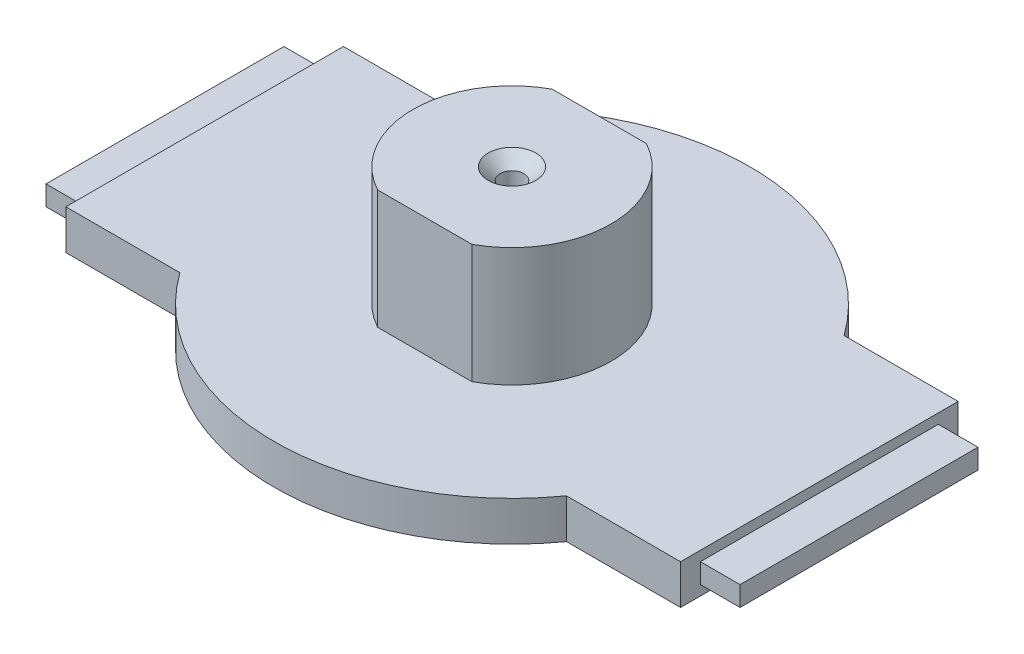
ISO-10303-21;
HEADER;
FILE_DESCRIPTION(('STEP AP214'),'2;1');
FILE_NAME('part.step','',(''),(''),'','','');
FILE_SCHEMA(('AUTOMOTIVE_DESIGN { 1 0 10303 214 1 1 1 1 }'));
ENDSEC;
DATA;
#1=APPLICATION_CONTEXT('core data for automotive mechanical design processes');
#2=APPLICATION_PROTOCOL_DEFINITION('international standard','automotive_design',2000,#1);
#3=PRODUCT_CONTEXT('',#1,'mechanical');
#4=PRODUCT('Part','Part','',(#3));
#5=PRODUCT_RELATED_PRODUCT_CATEGORY('part','',(#4));
#6=PRODUCT_DEFINITION_FORMATION('','',#4);
#7=PRODUCT_DEFINITION_CONTEXT('part definition',#1,'design');
#8=PRODUCT_DEFINITION('design','',#6,#7);
#9=PRODUCT_DEFINITION_SHAPE('','',#8);
#10=(LENGTH_UNIT() NAMED_UNIT(*) SI_UNIT(.MILLI.,.METRE.));
#11=(NAMED_UNIT(*) PLANE_ANGLE_UNIT() SI_UNIT($,.RADIAN.));
#12=(NAMED_UNIT(*) SI_UNIT($,.STERADIAN.) SOLID_ANGLE_UNIT());
#13=UNCERTAINTY_MEASURE_WITH_UNIT(LENGTH_MEASURE(1.E-05),#10,'distance_accuracy_value','');
#14=(GEOMETRIC_REPRESENTATION_CONTEXT(3) GLOBAL_UNCERTAINTY_ASSIGNED_CONTEXT((#13)) GLOBAL_UNIT_ASSIGNED_CONTEXT((#10,
#11,#12)) REPRESENTATION_CONTEXT('',''));
#15=CARTESIAN_POINT('',(0.,0.,0.));
#16=DIRECTION('',(0.,0.,1.));
#17=DIRECTION('',(1.,0.,0.));
#18=AXIS2_PLACEMENT_3D('',#15,#16,#17);
#19=CARTESIAN_POINT('',(-77.5,0.,0.));
#20=DIRECTION('',(1.,0.,0.));
#21=DIRECTION('',(0.,1.,0.));
#22=AXIS2_PLACEMENT_3D('',#19,#20,#21);
#23=PLANE('',#22);
#24=DIRECTION('',(0.,0.,-1.));
#25=VECTOR('',#24,1.);
#26=CARTESIAN_POINT('',(-77.5,0.,0.));
#27=LINE('',#26,#25);
#28=CARTESIAN_POINT('',(-77.5,0.,35.));
#29=VERTEX_POINT('',#28);
#30=CARTESIAN_POINT('',(-77.5,0.,-35.));
#31=VERTEX_POINT('',#30);
#32=EDGE_CURVE('E268',#29,#31,#27,.T.);
#33=ORIENTED_EDGE('',*,*,#32,.F.);
#34=DIRECTION('',(0.,-1.,0.));
#35=VECTOR('',#34,1.);
#36=CARTESIAN_POINT('',(-77.5,10.,35.));
#37=LINE('',#36,#35);
#38=CARTESIAN_POINT('',(-77.5,10.,35.));
#39=VERTEX_POINT('',#38);
#40=EDGE_CURVE('E263',#39,#29,#37,.T.);
#41=ORIENTED_EDGE('',*,*,#40,.F.);
#42=DIRECTION('',(0.,0.,-1.));
#43=VECTOR('',#42,1.);
#44=CARTESIAN_POINT('',(-77.5,10.,0.));
#45=LINE('',#44,#43);
#46=CARTESIAN_POINT('',(-77.5,10.,-35.));
#47=VERTEX_POINT('',#46);
#48=EDGE_CURVE('E259',#39,#47,#45,.T.);
#49=ORIENTED_EDGE('',*,*,#48,.T.);
#50=DIRECTION('',(0.,1.,0.));
#51=VECTOR('',#50,1.);
#52=CARTESIAN_POINT('',(-77.5,9.99999999999997,-35.));
#53=LINE('',#52,#51);
#54=EDGE_CURVE('E267',#31,#47,#53,.T.);
#55=ORIENTED_EDGE('',*,*,#54,.F.);
#56=EDGE_LOOP('',(#33,#41,#49,#55));
#57=FACE_BOUND('',#56,.T.);
#58=DIRECTION('',(0.,1.,0.));
#59=VECTOR('',#58,1.);
#60=CARTESIAN_POINT('',(-77.5,7.49999999999996,30.));
#61=LINE('',#60,#59);
#62=CARTESIAN_POINT('',(-77.5,2.49999999999996,30.));
#63=VERTEX_POINT('',#62);
#64=CARTESIAN_POINT('',(-77.5,7.49999999999996,30.));
#65=VERTEX_POINT('',#64);
#66=EDGE_CURVE('E56',#63,#65,#61,.T.);
#67=ORIENTED_EDGE('',*,*,#66,.F.);
#68=DIRECTION('',(0.,0.,1.));
#69=VECTOR('',#68,1.);
#70=CARTESIAN_POINT('',(-77.5,2.49999999999996,-30.));
#71=LINE('',#70,#69);
#72=CARTESIAN_POINT('',(-77.5,2.49999999999996,-30.));
#73=VERTEX_POINT('',#72);
#74=EDGE_CURVE('E60',#73,#63,#71,.T.);
#75=ORIENTED_EDGE('',*,*,#74,.F.);
#76=DIRECTION('',(0.,-1.,0.));
#77=VECTOR('',#76,1.);
#78=CARTESIAN_POINT('',(-77.5,7.49999999999996,-30.));
#79=LINE('',#78,#77);
#80=CARTESIAN_POINT('',(-77.5,7.49999999999996,-30.));
#81=VERTEX_POINT('',#80);
#82=EDGE_CURVE('E774',#81,#73,#79,.T.);
#83=ORIENTED_EDGE('',*,*,#82,.F.);
#84=DIRECTION('',(0.,0.,-1.));
#85=VECTOR('',#84,1.);
#86=CARTESIAN_POINT('',(-77.5,7.49999999999996,-30.));
#87=LINE('',#86,#85);
#88=EDGE_CURVE('E780',#65,#81,#87,.T.);
#89=ORIENTED_EDGE('',*,*,#88,.F.);
#90=EDGE_LOOP('',(#67,#75,#83,#89));
#91=FACE_BOUND('',#90,.T.);
#92=ADVANCED_FACE('F39',(#57,#91),#23,.F.);
#93=CARTESIAN_POINT('',(77.5,0.,0.));
#94=DIRECTION('',(-1.,0.,0.));
#95=DIRECTION('',(0.,-1.,0.));
#96=AXIS2_PLACEMENT_3D('',#93,#94,#95);
#97=PLANE('',#96);
#98=DIRECTION('',(0.,0.,1.));
#99=VECTOR('',#98,1.);
#100=CARTESIAN_POINT('',(77.5,0.,0.));
#101=LINE('',#100,#99);
#102=CARTESIAN_POINT('',(77.5,0.,-35.));
#103=VERTEX_POINT('',#102);
#104=CARTESIAN_POINT('',(77.5,0.,35.));
#105=VERTEX_POINT('',#104);
#106=EDGE_CURVE('E264',#103,#105,#101,.T.);
#107=ORIENTED_EDGE('',*,*,#106,.F.);
#108=DIRECTION('',(0.,-1.,0.));
#109=VECTOR('',#108,1.);
#110=CARTESIAN_POINT('',(77.5,10.,-35.));
#111=LINE('',#110,#109);
#112=CARTESIAN_POINT('',(77.5,10.,-35.));
#113=VERTEX_POINT('',#112);
#114=EDGE_CURVE('E262',#113,#103,#111,.T.);
#115=ORIENTED_EDGE('',*,*,#114,.F.);
#116=DIRECTION('',(0.,0.,-1.));
#117=VECTOR('',#116,1.);
#118=CARTESIAN_POINT('',(77.5,10.,0.));
#119=LINE('',#118,#117);
#120=CARTESIAN_POINT('',(77.5,10.,35.));
#121=VERTEX_POINT('',#120);
#122=EDGE_CURVE('E11',#121,#113,#119,.T.);
#123=ORIENTED_EDGE('',*,*,#122,.F.);
#124=DIRECTION('',(0.,1.,0.));
#125=VECTOR('',#124,1.);
#126=CARTESIAN_POINT('',(77.5,9.99999999999997,35.));
#127=LINE('',#126,#125);
#128=EDGE_CURVE('E260',#105,#121,#127,.T.);
#129=ORIENTED_EDGE('',*,*,#128,.F.);
#130=EDGE_LOOP('',(#107,#115,#123,#129));
#131=FACE_BOUND('',#130,.T.);
#132=DIRECTION('',(0.,1.,0.));
#133=VECTOR('',#132,1.);
#134=CARTESIAN_POINT('',(77.5,7.49999999999996,-30.));
#135=LINE('',#134,#133);
#136=CARTESIAN_POINT('',(77.5,2.49999999999996,-30.));
#137=VERTEX_POINT('',#136);
#138=CARTESIAN_POINT('',(77.5,7.49999999999996,-30.));
#139=VERTEX_POINT('',#138);
#140=EDGE_CURVE('E221',#137,#139,#135,.T.);
#141=ORIENTED_EDGE('',*,*,#140,.F.);
#142=DIRECTION('',(0.,0.,-1.));
#143=VECTOR('',#142,1.);
#144=CARTESIAN_POINT('',(77.5,2.49999999999996,30.));
#145=LINE('',#144,#143);
#146=CARTESIAN_POINT('',(77.5,2.49999999999996,30.));
#147=VERTEX_POINT('',#146);
#148=EDGE_CURVE('E234',#147,#137,#145,.T.);
#149=ORIENTED_EDGE('',*,*,#148,.F.);
#150=DIRECTION('',(0.,-1.,0.));
#151=VECTOR('',#150,1.);
#152=CARTESIAN_POINT('',(77.5,7.49999999999996,30.));
#153=LINE('',#152,#151);
#154=CARTESIAN_POINT('',(77.5,7.49999999999996,30.));
#155=VERTEX_POINT('',#154);
#156=EDGE_CURVE('E243',#155,#147,#153,.T.);
#157=ORIENTED_EDGE('',*,*,#156,.F.);
#158=DIRECTION('',(0.,0.,1.));
#159=VECTOR('',#158,1.);
#160=CARTESIAN_POINT('',(77.5,7.49999999999996,30.));
#161=LINE('',#160,#159);
#162=EDGE_CURVE('E224',#139,#155,#161,.T.);
#163=ORIENTED_EDGE('',*,*,#162,.F.);
#164=EDGE_LOOP('',(#141,#149,#157,#163));
#165=FACE_BOUND('',#164,.T.);
#166=ADVANCED_FACE('F419',(#131,#165),#97,.F.);
#167=CARTESIAN_POINT('',(0.,-0.001000000000001,0.));
#168=DIRECTION('',(0.,1.,0.));
#169=DIRECTION('',(0.,0.,1.));
#170=AXIS2_PLACEMENT_3D('',#167,#168,#169);
#171=CYLINDRICAL_SURFACE('',#170,3.);
#172=CARTESIAN_POINT('',(0.,37.,0.));
#173=DIRECTION('',(0.,1.,0.));
#174=DIRECTION('',(0.,0.,1.));
#175=AXIS2_PLACEMENT_3D('',#172,#173,#174);
#176=CIRCLE('',#175,3.);
#177=CARTESIAN_POINT('',(0.,37.,3.));
#178=VERTEX_POINT('',#177);
#179=EDGE_CURVE('E273',#178,#178,#176,.T.);
#180=ORIENTED_EDGE('',*,*,#179,.T.);
#181=EDGE_LOOP('',(#180));
#182=FACE_BOUND('',#181,.T.);
#183=CARTESIAN_POINT('',(0.,30.,0.));
#184=DIRECTION('',(0.,1.,0.));
#185=DIRECTION('',(0.,0.,1.));
#186=AXIS2_PLACEMENT_3D('',#183,#184,#185);
#187=CIRCLE('',#186,3.);
#188=CARTESIAN_POINT('',(0.,30.,3.));
#189=VERTEX_POINT('',#188);
#190=EDGE_CURVE('E48',#189,#189,#187,.F.);
#191=ORIENTED_EDGE('',*,*,#190,.T.);
#192=EDGE_LOOP('',(#191));
#193=FACE_BOUND('',#192,.T.);
#194=ADVANCED_FACE('F445',(#182,#193),#171,.F.);
#195=CARTESIAN_POINT('',(0.,37.,0.));
#196=DIRECTION('',(0.,1.,0.));
#197=DIRECTION('',(0.,0.,1.));
#198=AXIS2_PLACEMENT_3D('',#195,#196,#197);
#199=CONICAL_SURFACE('',#198,3.,0.785398163397454);
#200=CARTESIAN_POINT('',(0.,40.,0.));
#201=DIRECTION('',(0.,1.,0.));
#202=DIRECTION('',(0.,0.,1.));
#203=AXIS2_PLACEMENT_3D('',#200,#201,#202);
#204=CIRCLE('',#203,6.00000000000001);
#205=CARTESIAN_POINT('',(0.,40.,6.00000000000001));
#206=VERTEX_POINT('',#205);
#207=EDGE_CURVE('E270',#206,#206,#204,.F.);
#208=ORIENTED_EDGE('',*,*,#207,.F.);
#209=EDGE_LOOP('',(#208));
#210=FACE_BOUND('',#209,.T.);
#211=ORIENTED_EDGE('',*,*,#179,.F.);
#212=EDGE_LOOP('',(#211));
#213=FACE_BOUND('',#212,.T.);
#214=ADVANCED_FACE('F497',(#210,#213),#199,.F.);
#215=CARTESIAN_POINT('',(0.,30.,0.));
#216=DIRECTION('',(0.,1.,0.));
#217=DIRECTION('',(0.,0.,1.));
#218=AXIS2_PLACEMENT_3D('',#215,#216,#217);
#219=PLANE('',#218);
#220=ORIENTED_EDGE('',*,*,#190,.F.);
#221=EDGE_LOOP('',(#220));
#222=FACE_BOUND('',#221,.T.);
#223=DIRECTION('',(1.,0.,0.));
#224=VECTOR('',#223,1.);
#225=CARTESIAN_POINT('',(-9.,30.,12.));
#226=LINE('',#225,#224);
#227=CARTESIAN_POINT('',(-9.,30.,12.));
#228=VERTEX_POINT('',#227);
#229=CARTESIAN_POINT('',(9.,30.,12.));
#230=VERTEX_POINT('',#229);
#231=EDGE_CURVE('E361',#228,#230,#226,.T.);
#232=ORIENTED_EDGE('',*,*,#231,.F.);
#233=CARTESIAN_POINT('',(0.,30.,0.));
#234=DIRECTION('',(0.,1.,0.));
#235=DIRECTION('',(0.,0.,1.));
#236=AXIS2_PLACEMENT_3D('',#233,#234,#235);
#237=CIRCLE('',#236,15.);
#238=CARTESIAN_POINT('',(-9.,30.,-12.));
#239=VERTEX_POINT('',#238);
#240=EDGE_CURVE('E364',#239,#228,#237,.T.);
#241=ORIENTED_EDGE('',*,*,#240,.F.);
#242=DIRECTION('',(-1.,0.,0.));
#243=VECTOR('',#242,1.);
#244=CARTESIAN_POINT('',(9.,30.,-12.));
#245=LINE('',#244,#243);
#246=CARTESIAN_POINT('',(9.,30.,-12.));
#247=VERTEX_POINT('',#246);
#248=EDGE_CURVE('E355',#247,#239,#245,.T.);
#249=ORIENTED_EDGE('',*,*,#248,.F.);
#250=CARTESIAN_POINT('',(0.,30.,0.));
#251=DIRECTION('',(0.,1.,0.));
#252=DIRECTION('',(0.,0.,1.));
#253=AXIS2_PLACEMENT_3D('',#250,#251,#252);
#254=CIRCLE('',#253,15.);
#255=EDGE_CURVE('E358',#230,#247,#254,.T.);
#256=ORIENTED_EDGE('',*,*,#255,.F.);
#257=EDGE_LOOP('',(#232,#241,#249,#256));
#258=FACE_BOUND('',#257,.T.);
#259=ADVANCED_FACE('F495',(#222,#258),#219,.F.);
#260=CARTESIAN_POINT('',(0.,40.,0.));
#261=DIRECTION('',(0.,1.,0.));
#262=DIRECTION('',(0.,0.,1.));
#263=AXIS2_PLACEMENT_3D('',#260,#261,#262);
#264=PLANE('',#263);
#265=ORIENTED_EDGE('',*,*,#207,.T.);
#266=EDGE_LOOP('',(#265));
#267=FACE_BOUND('',#266,.T.);
#268=CARTESIAN_POINT('',(0.,40.,0.));
#269=DIRECTION('',(0.,1.,0.));
#270=DIRECTION('',(0.,0.,1.));
#271=AXIS2_PLACEMENT_3D('',#268,#269,#270);
#272=CIRCLE('',#271,25.);
#273=CARTESIAN_POINT('',(-11.874342087038,40.,-22.));
#274=VERTEX_POINT('',#273);
#275=CARTESIAN_POINT('',(-11.874342087038,40.,22.));
#276=VERTEX_POINT('',#275);
#277=EDGE_CURVE('E376',#274,#276,#272,.T.);
#278=ORIENTED_EDGE('',*,*,#277,.T.);
#279=DIRECTION('',(1.,0.,0.));
#280=VECTOR('',#279,1.);
#281=CARTESIAN_POINT('',(-11.874342087038,40.,22.));
#282=LINE('',#281,#280);
#283=CARTESIAN_POINT('',(11.874342087038,40.,22.));
#284=VERTEX_POINT('',#283);
#285=EDGE_CURVE('E373',#276,#284,#282,.T.);
#286=ORIENTED_EDGE('',*,*,#285,.T.);
#287=CARTESIAN_POINT('',(0.,40.,0.));
#288=DIRECTION('',(0.,1.,0.));
#289=DIRECTION('',(0.,0.,1.));
#290=AXIS2_PLACEMENT_3D('',#287,#288,#289);
#291=CIRCLE('',#290,25.);
#292=CARTESIAN_POINT('',(11.874342087038,40.,-22.));
#293=VERTEX_POINT('',#292);
#294=EDGE_CURVE('E370',#284,#293,#291,.T.);
#295=ORIENTED_EDGE('',*,*,#294,.T.);
#296=DIRECTION('',(-1.,0.,0.));
#297=VECTOR('',#296,1.);
#298=CARTESIAN_POINT('',(11.874342087038,40.,-22.));
#299=LINE('',#298,#297);
#300=EDGE_CURVE('E367',#293,#274,#299,.T.);
#301=ORIENTED_EDGE('',*,*,#300,.T.);
#302=EDGE_LOOP('',(#278,#286,#295,#301));
#303=FACE_BOUND('',#302,.T.);
#304=ADVANCED_FACE('F477',(#267,#303),#264,.T.);
#305=CARTESIAN_POINT('',(-9.,10.,12.));
#306=DIRECTION('',(0.,0.,-1.));
#307=DIRECTION('',(-1.,0.,0.));
#308=AXIS2_PLACEMENT_3D('',#305,#306,#307);
#309=PLANE('',#308);
#310=DIRECTION('',(1.,0.,0.));
#311=VECTOR('',#310,1.);
#312=CARTESIAN_POINT('',(-9.,0.,12.));
#313=LINE('',#312,#311);
#314=CARTESIAN_POINT('',(-9.,0.,12.));
#315=VERTEX_POINT('',#314);
#316=CARTESIAN_POINT('',(9.,0.,12.));
#317=VERTEX_POINT('',#316);
#318=EDGE_CURVE('E323',#315,#317,#313,.T.);
#319=ORIENTED_EDGE('',*,*,#318,.F.);
#320=DIRECTION('',(0.,-1.,0.));
#321=VECTOR('',#320,1.);
#322=CARTESIAN_POINT('',(-9.,10.,12.));
#323=LINE('',#322,#321);
#324=EDGE_CURVE('E318',#228,#315,#323,.T.);
#325=ORIENTED_EDGE('',*,*,#324,.F.);
#326=ORIENTED_EDGE('',*,*,#231,.T.);
#327=DIRECTION('',(0.,-1.,0.));
#328=VECTOR('',#327,1.);
#329=CARTESIAN_POINT('',(9.,10.,12.));
#330=LINE('',#329,#328);
#331=EDGE_CURVE('E320',#230,#317,#330,.T.);
#332=ORIENTED_EDGE('',*,*,#331,.T.);
#333=EDGE_LOOP('',(#319,#325,#326,#332));
#334=FACE_BOUND('',#333,.T.);
#335=ADVANCED_FACE('F473',(#334),#309,.T.);
#336=CARTESIAN_POINT('',(0.,10.,0.));
#337=DIRECTION('',(0.,-1.,0.));
#338=DIRECTION('',(0.,0.,-1.));
#339=AXIS2_PLACEMENT_3D('',#336,#337,#338);
#340=CYLINDRICAL_SURFACE('',#339,15.);
#341=CARTESIAN_POINT('',(0.,0.,0.));
#342=DIRECTION('',(0.,1.,0.));
#343=DIRECTION('',(0.,0.,1.));
#344=AXIS2_PLACEMENT_3D('',#341,#342,#343);
#345=CIRCLE('',#344,15.);
#346=CARTESIAN_POINT('',(-9.,0.,-12.));
#347=VERTEX_POINT('',#346);
#348=EDGE_CURVE('E326',#347,#315,#345,.T.);
#349=ORIENTED_EDGE('',*,*,#348,.F.);
#350=DIRECTION('',(0.,-1.,0.));
#351=VECTOR('',#350,1.);
#352=CARTESIAN_POINT('',(-9.,10.,-12.));
#353=LINE('',#352,#351);
#354=EDGE_CURVE('E316',#239,#347,#353,.T.);
#355=ORIENTED_EDGE('',*,*,#354,.F.);
#356=ORIENTED_EDGE('',*,*,#240,.T.);
#357=ORIENTED_EDGE('',*,*,#324,.T.);
#358=EDGE_LOOP('',(#349,#355,#356,#357));
#359=FACE_BOUND('',#358,.T.);
#360=ADVANCED_FACE('F466',(#359),#340,.F.);
#361=CARTESIAN_POINT('',(9.,10.,-12.));
#362=DIRECTION('',(0.,0.,1.));
#363=DIRECTION('',(1.,0.,0.));
#364=AXIS2_PLACEMENT_3D('',#361,#362,#363);
#365=PLANE('',#364);
#366=DIRECTION('',(-1.,0.,0.));
#367=VECTOR('',#366,1.);
#368=CARTESIAN_POINT('',(9.,0.,-12.));
#369=LINE('',#368,#367);
#370=CARTESIAN_POINT('',(9.,0.,-12.));
#371=VERTEX_POINT('',#370);
#372=EDGE_CURVE('E329',#371,#347,#369,.T.);
#373=ORIENTED_EDGE('',*,*,#372,.F.);
#374=DIRECTION('',(0.,-1.,0.));
#375=VECTOR('',#374,1.);
#376=CARTESIAN_POINT('',(9.,10.,-12.));
#377=LINE('',#376,#375);
#378=EDGE_CURVE('E298',#247,#371,#377,.T.);
#379=ORIENTED_EDGE('',*,*,#378,.F.);
#380=ORIENTED_EDGE('',*,*,#248,.T.);
#381=ORIENTED_EDGE('',*,*,#354,.T.);
#382=EDGE_LOOP('',(#373,#379,#380,#381));
#383=FACE_BOUND('',#382,.T.);
#384=ADVANCED_FACE('F458',(#383),#365,.T.);
#385=CARTESIAN_POINT('',(0.,10.,0.));
#386=DIRECTION('',(0.,-1.,0.));
#387=DIRECTION('',(0.,0.,-1.));
#388=AXIS2_PLACEMENT_3D('',#385,#386,#387);
#389=CYLINDRICAL_SURFACE('',#388,15.);
#390=CARTESIAN_POINT('',(0.,0.,0.));
#391=DIRECTION('',(0.,1.,0.));
#392=DIRECTION('',(0.,0.,1.));
#393=AXIS2_PLACEMENT_3D('',#390,#391,#392);
#394=CIRCLE('',#393,15.);
#395=EDGE_CURVE('E332',#317,#371,#394,.T.);
#396=ORIENTED_EDGE('',*,*,#395,.F.);
#397=ORIENTED_EDGE('',*,*,#331,.F.);
#398=ORIENTED_EDGE('',*,*,#255,.T.);
#399=ORIENTED_EDGE('',*,*,#378,.T.);
#400=EDGE_LOOP('',(#396,#397,#398,#399));
#401=FACE_BOUND('',#400,.T.);
#402=ADVANCED_FACE('F452',(#401),#389,.F.);
#403=CARTESIAN_POINT('',(0.,0.,0.));
#404=DIRECTION('',(0.,1.,0.));
#405=DIRECTION('',(0.,0.,1.));
#406=AXIS2_PLACEMENT_3D('',#403,#404,#405);
#407=PLANE('',#406);
#408=DIRECTION('',(1.,0.,0.));
#409=VECTOR('',#408,1.);
#410=CARTESIAN_POINT('',(-85.,0.,35.));
#411=LINE('',#410,#409);
#412=CARTESIAN_POINT('',(-48.7339717240448,0.,35.));
#413=VERTEX_POINT('',#412);
#414=EDGE_CURVE('E294',#29,#413,#411,.T.);
#415=ORIENTED_EDGE('',*,*,#414,.F.);
#416=ORIENTED_EDGE('',*,*,#32,.T.);
#417=DIRECTION('',(-1.,0.,0.));
#418=VECTOR('',#417,1.);
#419=CARTESIAN_POINT('',(-48.7339717240448,0.,-35.));
#420=LINE('',#419,#418);
#421=CARTESIAN_POINT('',(-48.7339717240448,0.,-35.));
#422=VERTEX_POINT('',#421);
#423=EDGE_CURVE('E299',#422,#31,#420,.T.);
#424=ORIENTED_EDGE('',*,*,#423,.F.);
#425=CARTESIAN_POINT('',(0.,0.,0.));
#426=DIRECTION('',(0.,1.,0.));
#427=DIRECTION('',(0.,0.,1.));
#428=AXIS2_PLACEMENT_3D('',#425,#426,#427);
#429=CIRCLE('',#428,60.);
#430=CARTESIAN_POINT('',(48.7339717240448,0.,-35.));
#431=VERTEX_POINT('',#430);
#432=EDGE_CURVE('E295',#431,#422,#429,.T.);
#433=ORIENTED_EDGE('',*,*,#432,.F.);
#434=DIRECTION('',(-1.,0.,0.));
#435=VECTOR('',#434,1.);
#436=CARTESIAN_POINT('',(85.,0.,-35.));
#437=LINE('',#436,#435);
#438=EDGE_CURVE('E43',#103,#431,#437,.T.);
#439=ORIENTED_EDGE('',*,*,#438,.F.);
#440=ORIENTED_EDGE('',*,*,#106,.T.);
#441=DIRECTION('',(1.,0.,0.));
#442=VECTOR('',#441,1.);
#443=CARTESIAN_POINT('',(48.7339717240448,0.,35.));
#444=LINE('',#443,#442);
#445=CARTESIAN_POINT('',(48.7339717240448,0.,35.));
#446=VERTEX_POINT('',#445);
#447=EDGE_CURVE('E289',#446,#105,#444,.T.);
#448=ORIENTED_EDGE('',*,*,#447,.F.);
#449=CARTESIAN_POINT('',(0.,0.,0.));
#450=DIRECTION('',(0.,1.,0.));
#451=DIRECTION('',(0.,0.,1.));
#452=AXIS2_PLACEMENT_3D('',#449,#450,#451);
#453=CIRCLE('',#452,60.);
#454=EDGE_CURVE('E292',#413,#446,#453,.T.);
#455=ORIENTED_EDGE('',*,*,#454,.F.);
#456=EDGE_LOOP('',(#415,#416,#424,#433,#439,#440,#448,#455));
#457=FACE_BOUND('',#456,.T.);
#458=ORIENTED_EDGE('',*,*,#395,.T.);
#459=ORIENTED_EDGE('',*,*,#372,.T.);
#460=ORIENTED_EDGE('',*,*,#348,.T.);
#461=ORIENTED_EDGE('',*,*,#318,.T.);
#462=EDGE_LOOP('',(#458,#459,#460,#461));
#463=FACE_BOUND('',#462,.T.);
#464=ADVANCED_FACE('F400',(#457,#463),#407,.F.);
#465=CARTESIAN_POINT('',(0.,10.,0.));
#466=DIRECTION('',(0.,-1.,0.));
#467=DIRECTION('',(0.,0.,-1.));
#468=AXIS2_PLACEMENT_3D('',#465,#466,#467);
#469=CYLINDRICAL_SURFACE('',#468,60.);
#470=ORIENTED_EDGE('',*,*,#454,.T.);
#471=DIRECTION('',(0.,-1.,0.));
#472=VECTOR('',#471,1.);
#473=CARTESIAN_POINT('',(48.7339717240448,10.,35.));
#474=LINE('',#473,#472);
#475=CARTESIAN_POINT('',(48.7339717240448,10.,35.));
#476=VERTEX_POINT('',#475);
#477=EDGE_CURVE('E282',#476,#446,#474,.T.);
#478=ORIENTED_EDGE('',*,*,#477,.F.);
#479=CARTESIAN_POINT('',(0.,10.,0.));
#480=DIRECTION('',(0.,1.,0.));
#481=DIRECTION('',(0.,0.,1.));
#482=AXIS2_PLACEMENT_3D('',#479,#480,#481);
#483=CIRCLE('',#482,60.);
#484=CARTESIAN_POINT('',(-48.7339717240448,10.,35.));
#485=VERTEX_POINT('',#484);
#486=EDGE_CURVE('E304',#485,#476,#483,.T.);
#487=ORIENTED_EDGE('',*,*,#486,.F.);
#488=DIRECTION('',(0.,-1.,0.));
#489=VECTOR('',#488,1.);
#490=CARTESIAN_POINT('',(-48.7339717240448,10.,35.));
#491=LINE('',#490,#489);
#492=EDGE_CURVE('E279',#485,#413,#491,.T.);
#493=ORIENTED_EDGE('',*,*,#492,.T.);
#494=EDGE_LOOP('',(#470,#478,#487,#493));
#495=FACE_BOUND('',#494,.T.);
#496=ADVANCED_FACE('F410',(#495),#469,.T.);
#497=CARTESIAN_POINT('',(-85.,10.,35.));
#498=DIRECTION('',(0.,0.,-1.));
#499=DIRECTION('',(-1.,0.,0.));
#500=AXIS2_PLACEMENT_3D('',#497,#498,#499);
#501=PLANE('',#500);
#502=DIRECTION('',(1.,0.,0.));
#503=VECTOR('',#502,1.);
#504=CARTESIAN_POINT('',(-85.,10.,35.));
#505=LINE('',#504,#503);
#506=EDGE_CURVE('E306',#39,#485,#505,.T.);
#507=ORIENTED_EDGE('',*,*,#506,.F.);
#508=ORIENTED_EDGE('',*,*,#40,.T.);
#509=ORIENTED_EDGE('',*,*,#414,.T.);
#510=ORIENTED_EDGE('',*,*,#492,.F.);
#511=EDGE_LOOP('',(#507,#508,#509,#510));
#512=FACE_BOUND('',#511,.T.);
#513=ADVANCED_FACE('F407',(#512),#501,.F.);
#514=CARTESIAN_POINT('',(-48.7339717240448,10.,-35.));
#515=DIRECTION('',(0.,0.,1.));
#516=DIRECTION('',(1.,0.,0.));
#517=AXIS2_PLACEMENT_3D('',#514,#515,#516);
#518=PLANE('',#517);
#519=ORIENTED_EDGE('',*,*,#423,.T.);
#520=ORIENTED_EDGE('',*,*,#54,.T.);
#521=DIRECTION('',(-1.,0.,0.));
#522=VECTOR('',#521,1.);
#523=CARTESIAN_POINT('',(-48.7339717240448,10.,-35.));
#524=LINE('',#523,#522);
#525=CARTESIAN_POINT('',(-48.7339717240448,10.,-35.));
#526=VERTEX_POINT('',#525);
#527=EDGE_CURVE('E308',#526,#47,#524,.T.);
#528=ORIENTED_EDGE('',*,*,#527,.F.);
#529=DIRECTION('',(0.,-1.,0.));
#530=VECTOR('',#529,1.);
#531=CARTESIAN_POINT('',(-48.7339717240448,10.,-35.));
#532=LINE('',#531,#530);
#533=EDGE_CURVE('E276',#526,#422,#532,.T.);
#534=ORIENTED_EDGE('',*,*,#533,.T.);
#535=EDGE_LOOP('',(#519,#520,#528,#534));
#536=FACE_BOUND('',#535,.T.);
#537=ADVANCED_FACE('F41',(#536),#518,.F.);
#538=CARTESIAN_POINT('',(0.,10.,0.));
#539=DIRECTION('',(0.,-1.,0.));
#540=DIRECTION('',(0.,0.,-1.));
#541=AXIS2_PLACEMENT_3D('',#538,#539,#540);
#542=CYLINDRICAL_SURFACE('',#541,60.);
#543=ORIENTED_EDGE('',*,*,#432,.T.);
#544=ORIENTED_EDGE('',*,*,#533,.F.);
#545=CARTESIAN_POINT('',(0.,10.,0.));
#546=DIRECTION('',(0.,1.,0.));
#547=DIRECTION('',(0.,0.,1.));
#548=AXIS2_PLACEMENT_3D('',#545,#546,#547);
#549=CIRCLE('',#548,60.);
#550=CARTESIAN_POINT('',(48.7339717240448,10.,-35.));
#551=VERTEX_POINT('',#550);
#552=EDGE_CURVE('E311',#551,#526,#549,.T.);
#553=ORIENTED_EDGE('',*,*,#552,.F.);
#554=DIRECTION('',(0.,-1.,0.));
#555=VECTOR('',#554,1.);
#556=CARTESIAN_POINT('',(48.7339717240448,10.,-35.));
#557=LINE('',#556,#555);
#558=EDGE_CURVE('E285',#551,#431,#557,.T.);
#559=ORIENTED_EDGE('',*,*,#558,.T.);
#560=EDGE_LOOP('',(#543,#544,#553,#559));
#561=FACE_BOUND('',#560,.T.);
#562=ADVANCED_FACE('F426',(#561),#542,.T.);
#563=CARTESIAN_POINT('',(85.,10.,-35.));
#564=DIRECTION('',(0.,0.,1.));
#565=DIRECTION('',(1.,0.,0.));
#566=AXIS2_PLACEMENT_3D('',#563,#564,#565);
#567=PLANE('',#566);
#568=DIRECTION('',(-1.,0.,0.));
#569=VECTOR('',#568,1.);
#570=CARTESIAN_POINT('',(85.,10.,-35.));
#571=LINE('',#570,#569);
#572=EDGE_CURVE('E288',#113,#551,#571,.T.);
#573=ORIENTED_EDGE('',*,*,#572,.F.);
#574=ORIENTED_EDGE('',*,*,#114,.T.);
#575=ORIENTED_EDGE('',*,*,#438,.T.);
#576=ORIENTED_EDGE('',*,*,#558,.F.);
#577=EDGE_LOOP('',(#573,#574,#575,#576));
#578=FACE_BOUND('',#577,.T.);
#579=ADVANCED_FACE('F424',(#578),#567,.F.);
#580=CARTESIAN_POINT('',(48.7339717240448,10.,35.));
#581=DIRECTION('',(0.,0.,-1.));
#582=DIRECTION('',(-1.,0.,0.));
#583=AXIS2_PLACEMENT_3D('',#580,#581,#582);
#584=PLANE('',#583);
#585=ORIENTED_EDGE('',*,*,#447,.T.);
#586=ORIENTED_EDGE('',*,*,#128,.T.);
#587=DIRECTION('',(1.,0.,0.));
#588=VECTOR('',#587,1.);
#589=CARTESIAN_POINT('',(48.7339717240448,10.,35.));
#590=LINE('',#589,#588);
#591=EDGE_CURVE('E301',#476,#121,#590,.T.);
#592=ORIENTED_EDGE('',*,*,#591,.F.);
#593=ORIENTED_EDGE('',*,*,#477,.T.);
#594=EDGE_LOOP('',(#585,#586,#592,#593));
#595=FACE_BOUND('',#594,.T.);
#596=ADVANCED_FACE('F416',(#595),#584,.F.);
#597=CARTESIAN_POINT('',(0.,30.,0.));
#598=DIRECTION('',(0.,-1.,0.));
#599=DIRECTION('',(0.,0.,-1.));
#600=AXIS2_PLACEMENT_3D('',#597,#598,#599);
#601=CYLINDRICAL_SURFACE('',#600,25.);
#602=CARTESIAN_POINT('',(0.,10.,0.));
#603=DIRECTION('',(0.,1.,0.));
#604=DIRECTION('',(0.,0.,1.));
#605=AXIS2_PLACEMENT_3D('',#602,#603,#604);
#606=CIRCLE('',#605,25.);
#607=CARTESIAN_POINT('',(11.874342087038,10.,22.));
#608=VERTEX_POINT('',#607);
#609=CARTESIAN_POINT('',(11.874342087038,10.,-22.));
#610=VERTEX_POINT('',#609);
#611=EDGE_CURVE('E347',#608,#610,#606,.T.);
#612=ORIENTED_EDGE('',*,*,#611,.T.);
#613=DIRECTION('',(0.,-1.,0.));
#614=VECTOR('',#613,1.);
#615=CARTESIAN_POINT('',(11.874342087038,30.,-22.));
#616=LINE('',#615,#614);
#617=EDGE_CURVE('E340',#293,#610,#616,.T.);
#618=ORIENTED_EDGE('',*,*,#617,.F.);
#619=ORIENTED_EDGE('',*,*,#294,.F.);
#620=DIRECTION('',(0.,-1.,0.));
#621=VECTOR('',#620,1.);
#622=CARTESIAN_POINT('',(11.874342087038,30.,22.));
#623=LINE('',#622,#621);
#624=EDGE_CURVE('E337',#284,#608,#623,.T.);
#625=ORIENTED_EDGE('',*,*,#624,.T.);
#626=EDGE_LOOP('',(#612,#618,#619,#625));
#627=FACE_BOUND('',#626,.T.);
#628=ADVANCED_FACE('F488',(#627),#601,.T.);
#629=CARTESIAN_POINT('',(11.874342087038,30.,-22.));
#630=DIRECTION('',(0.,0.,1.));
#631=DIRECTION('',(1.,0.,0.));
#632=AXIS2_PLACEMENT_3D('',#629,#630,#631);
#633=PLANE('',#632);
#634=DIRECTION('',(-1.,0.,0.));
#635=VECTOR('',#634,1.);
#636=CARTESIAN_POINT('',(11.874342087038,10.,-22.));
#637=LINE('',#636,#635);
#638=CARTESIAN_POINT('',(-11.874342087038,10.,-22.));
#639=VERTEX_POINT('',#638);
#640=EDGE_CURVE('E345',#610,#639,#637,.T.);
#641=ORIENTED_EDGE('',*,*,#640,.T.);
#642=DIRECTION('',(0.,-1.,0.));
#643=VECTOR('',#642,1.);
#644=CARTESIAN_POINT('',(-11.874342087038,30.,-22.));
#645=LINE('',#644,#643);
#646=EDGE_CURVE('E342',#274,#639,#645,.T.);
#647=ORIENTED_EDGE('',*,*,#646,.F.);
#648=ORIENTED_EDGE('',*,*,#300,.F.);
#649=ORIENTED_EDGE('',*,*,#617,.T.);
#650=EDGE_LOOP('',(#641,#647,#648,#649));
#651=FACE_BOUND('',#650,.T.);
#652=ADVANCED_FACE('F483',(#651),#633,.F.);
#653=CARTESIAN_POINT('',(0.,30.,0.));
#654=DIRECTION('',(0.,-1.,0.));
#655=DIRECTION('',(0.,0.,-1.));
#656=AXIS2_PLACEMENT_3D('',#653,#654,#655);
#657=CYLINDRICAL_SURFACE('',#656,25.);
#658=CARTESIAN_POINT('',(0.,10.,0.));
#659=DIRECTION('',(0.,1.,0.));
#660=DIRECTION('',(0.,0.,1.));
#661=AXIS2_PLACEMENT_3D('',#658,#659,#660);
#662=CIRCLE('',#661,25.);
#663=CARTESIAN_POINT('',(-11.874342087038,10.,22.));
#664=VERTEX_POINT('',#663);
#665=EDGE_CURVE('E352',#639,#664,#662,.T.);
#666=ORIENTED_EDGE('',*,*,#665,.T.);
#667=DIRECTION('',(0.,-1.,0.));
#668=VECTOR('',#667,1.);
#669=CARTESIAN_POINT('',(-11.874342087038,30.,22.));
#670=LINE('',#669,#668);
#671=EDGE_CURVE('E335',#276,#664,#670,.T.);
#672=ORIENTED_EDGE('',*,*,#671,.F.);
#673=ORIENTED_EDGE('',*,*,#277,.F.);
#674=ORIENTED_EDGE('',*,*,#646,.T.);
#675=EDGE_LOOP('',(#666,#672,#673,#674));
#676=FACE_BOUND('',#675,.T.);
#677=ADVANCED_FACE('F479',(#676),#657,.T.);
#678=CARTESIAN_POINT('',(-11.874342087038,30.,22.));
#679=DIRECTION('',(0.,0.,-1.));
#680=DIRECTION('',(-1.,0.,0.));
#681=AXIS2_PLACEMENT_3D('',#678,#679,#680);
#682=PLANE('',#681);
#683=DIRECTION('',(1.,0.,0.));
#684=VECTOR('',#683,1.);
#685=CARTESIAN_POINT('',(-11.874342087038,10.,22.));
#686=LINE('',#685,#684);
#687=EDGE_CURVE('E350',#664,#608,#686,.T.);
#688=ORIENTED_EDGE('',*,*,#687,.T.);
#689=ORIENTED_EDGE('',*,*,#624,.F.);
#690=ORIENTED_EDGE('',*,*,#285,.F.);
#691=ORIENTED_EDGE('',*,*,#671,.T.);
#692=EDGE_LOOP('',(#688,#689,#690,#691));
#693=FACE_BOUND('',#692,.T.);
#694=ADVANCED_FACE('F482',(#693),#682,.F.);
#695=CARTESIAN_POINT('',(0.,10.,0.));
#696=DIRECTION('',(0.,1.,0.));
#697=DIRECTION('',(0.,0.,1.));
#698=AXIS2_PLACEMENT_3D('',#695,#696,#697);
#699=PLANE('',#698);
#700=ORIENTED_EDGE('',*,*,#687,.F.);
#701=ORIENTED_EDGE('',*,*,#665,.F.);
#702=ORIENTED_EDGE('',*,*,#640,.F.);
#703=ORIENTED_EDGE('',*,*,#611,.F.);
#704=EDGE_LOOP('',(#700,#701,#702,#703));
#705=FACE_BOUND('',#704,.T.);
#706=ORIENTED_EDGE('',*,*,#591,.T.);
#707=ORIENTED_EDGE('',*,*,#122,.T.);
#708=ORIENTED_EDGE('',*,*,#572,.T.);
#709=ORIENTED_EDGE('',*,*,#552,.T.);
#710=ORIENTED_EDGE('',*,*,#527,.T.);
#711=ORIENTED_EDGE('',*,*,#48,.F.);
#712=ORIENTED_EDGE('',*,*,#506,.T.);
#713=ORIENTED_EDGE('',*,*,#486,.T.);
#714=EDGE_LOOP('',(#706,#707,#708,#709,#710,#711,#712,#713));
#715=FACE_BOUND('',#714,.T.);
#716=ADVANCED_FACE('F393',(#705,#715),#699,.T.);
#717=CARTESIAN_POINT('',(87.5,7.49999999999995,-30.));
#718=DIRECTION('',(0.,0.,1.));
#719=DIRECTION('',(1.,0.,0.));
#720=AXIS2_PLACEMENT_3D('',#717,#718,#719);
#721=PLANE('',#720);
#722=ORIENTED_EDGE('',*,*,#140,.T.);
#723=DIRECTION('',(-1.,0.,0.));
#724=VECTOR('',#723,1.);
#725=CARTESIAN_POINT('',(87.5,7.49999999999995,-30.));
#726=LINE('',#725,#724);
#727=CARTESIAN_POINT('',(87.5,7.49999999999995,-30.));
#728=VERTEX_POINT('',#727);
#729=EDGE_CURVE('E256',#728,#139,#726,.T.);
#730=ORIENTED_EDGE('',*,*,#729,.F.);
#731=DIRECTION('',(0.,1.,0.));
#732=VECTOR('',#731,1.);
#733=CARTESIAN_POINT('',(87.5,7.49999999999995,-30.));
#734=LINE('',#733,#732);
#735=CARTESIAN_POINT('',(87.5,2.49999999999995,-30.));
#736=VERTEX_POINT('',#735);
#737=EDGE_CURVE('E230',#736,#728,#734,.T.);
#738=ORIENTED_EDGE('',*,*,#737,.F.);
#739=DIRECTION('',(-1.,0.,0.));
#740=VECTOR('',#739,1.);
#741=CARTESIAN_POINT('',(87.5,2.49999999999995,-30.));
#742=LINE('',#741,#740);
#743=EDGE_CURVE('E239',#736,#137,#742,.T.);
#744=ORIENTED_EDGE('',*,*,#743,.T.);
#745=EDGE_LOOP('',(#722,#730,#738,#744));
#746=FACE_BOUND('',#745,.T.);
#747=ADVANCED_FACE('F517',(#746),#721,.F.);
#748=CARTESIAN_POINT('',(87.5,7.49999999999995,30.));
#749=DIRECTION('',(0.,-1.,0.));
#750=DIRECTION('',(1.,0.,0.));
#751=AXIS2_PLACEMENT_3D('',#748,#749,#750);
#752=PLANE('',#751);
#753=ORIENTED_EDGE('',*,*,#162,.T.);
#754=DIRECTION('',(-1.,0.,0.));
#755=VECTOR('',#754,1.);
#756=CARTESIAN_POINT('',(87.5,7.49999999999995,30.));
#757=LINE('',#756,#755);
#758=CARTESIAN_POINT('',(87.5,7.49999999999995,30.));
#759=VERTEX_POINT('',#758);
#760=EDGE_CURVE('E253',#759,#155,#757,.T.);
#761=ORIENTED_EDGE('',*,*,#760,.F.);
#762=DIRECTION('',(0.,0.,1.));
#763=VECTOR('',#762,1.);
#764=CARTESIAN_POINT('',(87.5,7.49999999999995,30.));
#765=LINE('',#764,#763);
#766=EDGE_CURVE('E233',#728,#759,#765,.T.);
#767=ORIENTED_EDGE('',*,*,#766,.F.);
#768=ORIENTED_EDGE('',*,*,#729,.T.);
#769=EDGE_LOOP('',(#753,#761,#767,#768));
#770=FACE_BOUND('',#769,.T.);
#771=ADVANCED_FACE('F523',(#770),#752,.F.);
#772=CARTESIAN_POINT('',(87.5,7.49999999999995,30.));
#773=DIRECTION('',(0.,0.,-1.));
#774=DIRECTION('',(-1.,0.,0.));
#775=AXIS2_PLACEMENT_3D('',#772,#773,#774);
#776=PLANE('',#775);
#777=ORIENTED_EDGE('',*,*,#156,.T.);
#778=DIRECTION('',(-1.,0.,0.));
#779=VECTOR('',#778,1.);
#780=CARTESIAN_POINT('',(87.5,2.49999999999995,30.));
#781=LINE('',#780,#779);
#782=CARTESIAN_POINT('',(87.5,2.49999999999995,30.));
#783=VERTEX_POINT('',#782);
#784=EDGE_CURVE('E250',#783,#147,#781,.T.);
#785=ORIENTED_EDGE('',*,*,#784,.F.);
#786=DIRECTION('',(0.,-1.,0.));
#787=VECTOR('',#786,1.);
#788=CARTESIAN_POINT('',(87.5,7.49999999999995,30.));
#789=LINE('',#788,#787);
#790=EDGE_CURVE('E236',#759,#783,#789,.T.);
#791=ORIENTED_EDGE('',*,*,#790,.F.);
#792=ORIENTED_EDGE('',*,*,#760,.T.);
#793=EDGE_LOOP('',(#777,#785,#791,#792));
#794=FACE_BOUND('',#793,.T.);
#795=ADVANCED_FACE('F530',(#794),#776,.F.);
#796=CARTESIAN_POINT('',(87.5,2.49999999999995,30.));
#797=DIRECTION('',(0.,1.,0.));
#798=DIRECTION('',(-1.,0.,0.));
#799=AXIS2_PLACEMENT_3D('',#796,#797,#798);
#800=PLANE('',#799);
#801=ORIENTED_EDGE('',*,*,#148,.T.);
#802=ORIENTED_EDGE('',*,*,#743,.F.);
#803=DIRECTION('',(0.,0.,-1.));
#804=VECTOR('',#803,1.);
#805=CARTESIAN_POINT('',(87.5,2.49999999999995,30.));
#806=LINE('',#805,#804);
#807=EDGE_CURVE('E238',#783,#736,#806,.T.);
#808=ORIENTED_EDGE('',*,*,#807,.F.);
#809=ORIENTED_EDGE('',*,*,#784,.T.);
#810=EDGE_LOOP('',(#801,#802,#808,#809));
#811=FACE_BOUND('',#810,.T.);
#812=ADVANCED_FACE('F701',(#811),#800,.F.);
#813=CARTESIAN_POINT('',(87.5,0.,0.));
#814=DIRECTION('',(1.,0.,0.));
#815=DIRECTION('',(0.,0.,-1.));
#816=AXIS2_PLACEMENT_3D('',#813,#814,#815);
#817=PLANE('',#816);
#818=ORIENTED_EDGE('',*,*,#737,.T.);
#819=ORIENTED_EDGE('',*,*,#766,.T.);
#820=ORIENTED_EDGE('',*,*,#790,.T.);
#821=ORIENTED_EDGE('',*,*,#807,.T.);
#822=EDGE_LOOP('',(#818,#819,#820,#821));
#823=FACE_BOUND('',#822,.T.);
#824=ADVANCED_FACE('F710',(#823),#817,.T.);
#825=CARTESIAN_POINT('',(-87.5,7.49999999999995,30.));
#826=DIRECTION('',(0.,0.,-1.));
#827=DIRECTION('',(-1.,0.,0.));
#828=AXIS2_PLACEMENT_3D('',#825,#826,#827);
#829=PLANE('',#828);
#830=ORIENTED_EDGE('',*,*,#66,.T.);
#831=DIRECTION('',(1.,0.,0.));
#832=VECTOR('',#831,1.);
#833=CARTESIAN_POINT('',(-87.5,7.49999999999995,30.));
#834=LINE('',#833,#832);
#835=CARTESIAN_POINT('',(-87.5,7.49999999999995,30.));
#836=VERTEX_POINT('',#835);
#837=EDGE_CURVE('E204',#836,#65,#834,.T.);
#838=ORIENTED_EDGE('',*,*,#837,.F.);
#839=DIRECTION('',(0.,1.,0.));
#840=VECTOR('',#839,1.);
#841=CARTESIAN_POINT('',(-87.5,7.49999999999995,30.));
#842=LINE('',#841,#840);
#843=CARTESIAN_POINT('',(-87.5,2.49999999999995,30.));
#844=VERTEX_POINT('',#843);
#845=EDGE_CURVE('E210',#844,#836,#842,.T.);
#846=ORIENTED_EDGE('',*,*,#845,.F.);
#847=DIRECTION('',(1.,0.,0.));
#848=VECTOR('',#847,1.);
#849=CARTESIAN_POINT('',(-87.5,2.49999999999995,30.));
#850=LINE('',#849,#848);
#851=EDGE_CURVE('E772',#844,#63,#850,.T.);
#852=ORIENTED_EDGE('',*,*,#851,.T.);
#853=EDGE_LOOP('',(#830,#838,#846,#852));
#854=FACE_BOUND('',#853,.T.);
#855=ADVANCED_FACE('F220',(#854),#829,.F.);
#856=CARTESIAN_POINT('',(-87.5,7.49999999999995,-30.));
#857=DIRECTION('',(0.,-1.,0.));
#858=DIRECTION('',(1.,0.,0.));
#859=AXIS2_PLACEMENT_3D('',#856,#857,#858);
#860=PLANE('',#859);
#861=ORIENTED_EDGE('',*,*,#88,.T.);
#862=DIRECTION('',(1.,0.,0.));
#863=VECTOR('',#862,1.);
#864=CARTESIAN_POINT('',(-87.5,7.49999999999995,-30.));
#865=LINE('',#864,#863);
#866=CARTESIAN_POINT('',(-87.5,7.49999999999995,-30.));
#867=VERTEX_POINT('',#866);
#868=EDGE_CURVE('E206',#867,#81,#865,.T.);
#869=ORIENTED_EDGE('',*,*,#868,.F.);
#870=DIRECTION('',(0.,0.,-1.));
#871=VECTOR('',#870,1.);
#872=CARTESIAN_POINT('',(-87.5,7.49999999999995,-30.));
#873=LINE('',#872,#871);
#874=EDGE_CURVE('E199',#836,#867,#873,.T.);
#875=ORIENTED_EDGE('',*,*,#874,.F.);
#876=ORIENTED_EDGE('',*,*,#837,.T.);
#877=EDGE_LOOP('',(#861,#869,#875,#876));
#878=FACE_BOUND('',#877,.T.);
#879=ADVANCED_FACE('F202',(#878),#860,.F.);
#880=CARTESIAN_POINT('',(-87.5,7.49999999999995,-30.));
#881=DIRECTION('',(0.,0.,1.));
#882=DIRECTION('',(1.,0.,0.));
#883=AXIS2_PLACEMENT_3D('',#880,#881,#882);
#884=PLANE('',#883);
#885=ORIENTED_EDGE('',*,*,#82,.T.);
#886=DIRECTION('',(1.,0.,0.));
#887=VECTOR('',#886,1.);
#888=CARTESIAN_POINT('',(-87.5,2.49999999999995,-30.));
#889=LINE('',#888,#887);
#890=CARTESIAN_POINT('',(-87.5,2.49999999999995,-30.));
#891=VERTEX_POINT('',#890);
#892=EDGE_CURVE('E226',#891,#73,#889,.T.);
#893=ORIENTED_EDGE('',*,*,#892,.F.);
#894=DIRECTION('',(0.,-1.,0.));
#895=VECTOR('',#894,1.);
#896=CARTESIAN_POINT('',(-87.5,7.49999999999995,-30.));
#897=LINE('',#896,#895);
#898=EDGE_CURVE('E209',#867,#891,#897,.T.);
#899=ORIENTED_EDGE('',*,*,#898,.F.);
#900=ORIENTED_EDGE('',*,*,#868,.T.);
#901=EDGE_LOOP('',(#885,#893,#899,#900));
#902=FACE_BOUND('',#901,.T.);
#903=ADVANCED_FACE('F733',(#902),#884,.F.);
#904=CARTESIAN_POINT('',(-87.5,2.49999999999995,-30.));
#905=DIRECTION('',(0.,1.,0.));
#906=DIRECTION('',(-1.,0.,0.));
#907=AXIS2_PLACEMENT_3D('',#904,#905,#906);
#908=PLANE('',#907);
#909=ORIENTED_EDGE('',*,*,#74,.T.);
#910=ORIENTED_EDGE('',*,*,#851,.F.);
#911=DIRECTION('',(0.,0.,1.));
#912=VECTOR('',#911,1.);
#913=CARTESIAN_POINT('',(-87.5,2.49999999999995,-30.));
#914=LINE('',#913,#912);
#915=EDGE_CURVE('E215',#891,#844,#914,.T.);
#916=ORIENTED_EDGE('',*,*,#915,.F.);
#917=ORIENTED_EDGE('',*,*,#892,.T.);
#918=EDGE_LOOP('',(#909,#910,#916,#917));
#919=FACE_BOUND('',#918,.T.);
#920=ADVANCED_FACE('F740',(#919),#908,.F.);
#921=CARTESIAN_POINT('',(-87.5,0.,0.));
#922=DIRECTION('',(-1.,0.,0.));
#923=DIRECTION('',(0.,0.,1.));
#924=AXIS2_PLACEMENT_3D('',#921,#922,#923);
#925=PLANE('',#924);
#926=ORIENTED_EDGE('',*,*,#845,.T.);
#927=ORIENTED_EDGE('',*,*,#874,.T.);
#928=ORIENTED_EDGE('',*,*,#898,.T.);
#929=ORIENTED_EDGE('',*,*,#915,.T.);
#930=EDGE_LOOP('',(#926,#927,#928,#929));
#931=FACE_BOUND('',#930,.T.);
#932=ADVANCED_FACE('F213',(#931),#925,.T.);
#933=CLOSED_SHELL('',(#92,#166,#194,#214,#259,#304,#335,#360,#384,#402,#464,#496,#513,#537,#562,
#579,#596,#628,#652,#677,#694,#716,#747,#771,#795,#812,#824,#855,#879,#903,#920,#932));
#934=MANIFOLD_SOLID_BREP('B2',#933);
#935=ADVANCED_BREP_SHAPE_REPRESENTATION('',(#18,#934),#14);
#936=SHAPE_DEFINITION_REPRESENTATION(#9,#935);
ENDSEC;
END-ISO-10303-21;
